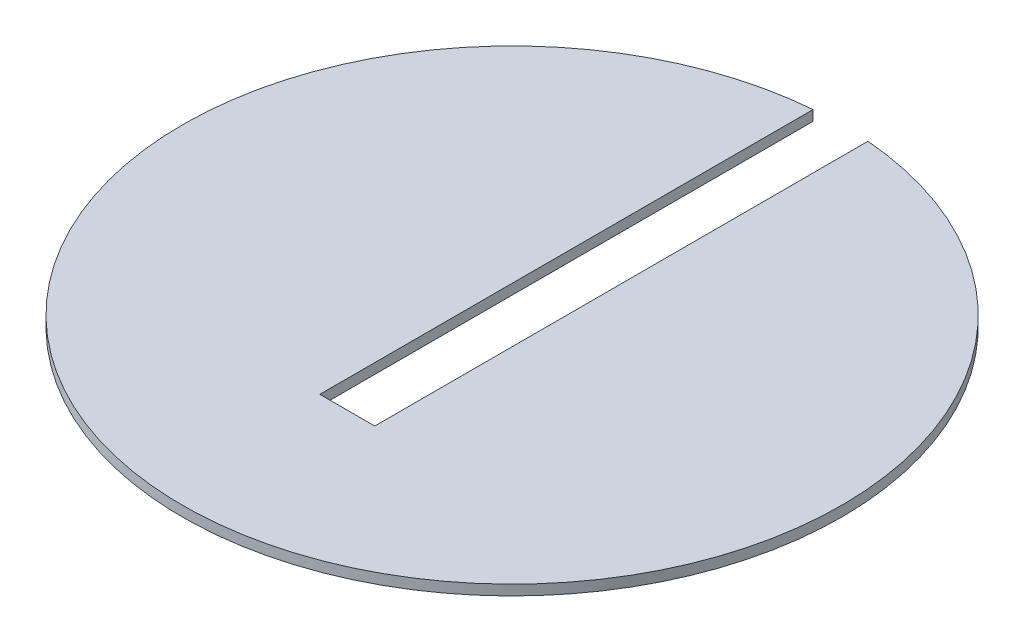
ISO-10303-21;
HEADER;
FILE_DESCRIPTION(('STEP AP214'),'2;1');
FILE_NAME('part.step','',(''),(''),'','','');
FILE_SCHEMA(('AUTOMOTIVE_DESIGN { 1 0 10303 214 1 1 1 1 }'));
ENDSEC;
DATA;
#1=APPLICATION_CONTEXT('core data for automotive mechanical design processes');
#2=APPLICATION_PROTOCOL_DEFINITION('international standard','automotive_design',2000,#1);
#3=PRODUCT_CONTEXT('',#1,'mechanical');
#4=PRODUCT('Part','Part','',(#3));
#5=PRODUCT_RELATED_PRODUCT_CATEGORY('part','',(#4));
#6=PRODUCT_DEFINITION_FORMATION('','',#4);
#7=PRODUCT_DEFINITION_CONTEXT('part definition',#1,'design');
#8=PRODUCT_DEFINITION('design','',#6,#7);
#9=PRODUCT_DEFINITION_SHAPE('','',#8);
#10=(LENGTH_UNIT() NAMED_UNIT(*) SI_UNIT(.MILLI.,.METRE.));
#11=(NAMED_UNIT(*) PLANE_ANGLE_UNIT() SI_UNIT($,.RADIAN.));
#12=(NAMED_UNIT(*) SI_UNIT($,.STERADIAN.) SOLID_ANGLE_UNIT());
#13=UNCERTAINTY_MEASURE_WITH_UNIT(LENGTH_MEASURE(1.E-05),#10,'distance_accuracy_value','');
#14=(GEOMETRIC_REPRESENTATION_CONTEXT(3) GLOBAL_UNCERTAINTY_ASSIGNED_CONTEXT((#13)) GLOBAL_UNIT_ASSIGNED_CONTEXT((#10,
#11,#12)) REPRESENTATION_CONTEXT('',''));
#15=CARTESIAN_POINT('',(0.,0.,0.));
#16=DIRECTION('',(0.,0.,1.));
#17=DIRECTION('',(1.,0.,0.));
#18=AXIS2_PLACEMENT_3D('',#15,#16,#17);
#19=CARTESIAN_POINT('',(0.,2.8,0.));
#20=DIRECTION('',(0.,-1.,0.));
#21=DIRECTION('',(0.,0.,-1.));
#22=AXIS2_PLACEMENT_3D('',#19,#20,#21);
#23=CYLINDRICAL_SURFACE('',#22,90.);
#24=CARTESIAN_POINT('',(0.,0.,0.));
#25=DIRECTION('',(0.,1.,0.));
#26=DIRECTION('',(0.,0.,1.));
#27=AXIS2_PLACEMENT_3D('',#24,#25,#26);
#28=CIRCLE('',#27,90.);
#29=CARTESIAN_POINT('',(-7.5,0.,-89.6869555732605));
#30=VERTEX_POINT('',#29);
#31=CARTESIAN_POINT('',(7.5,0.,-89.6869555732605));
#32=VERTEX_POINT('',#31);
#33=EDGE_CURVE('E96',#30,#32,#28,.T.);
#34=ORIENTED_EDGE('',*,*,#33,.T.);
#35=DIRECTION('',(0.,-1.,0.));
#36=VECTOR('',#35,1.);
#37=CARTESIAN_POINT('',(7.5,2.8,-89.6869555732605));
#38=LINE('',#37,#36);
#39=CARTESIAN_POINT('',(7.5,2.8,-89.6869555732605));
#40=VERTEX_POINT('',#39);
#41=EDGE_CURVE('E11',#40,#32,#38,.T.);
#42=ORIENTED_EDGE('',*,*,#41,.F.);
#43=CARTESIAN_POINT('',(0.,2.8,0.));
#44=DIRECTION('',(0.,1.,0.));
#45=DIRECTION('',(0.,0.,1.));
#46=AXIS2_PLACEMENT_3D('',#43,#44,#45);
#47=CIRCLE('',#46,90.);
#48=CARTESIAN_POINT('',(-7.5,2.8,-89.6869555732605));
#49=VERTEX_POINT('',#48);
#50=EDGE_CURVE('E84',#49,#40,#47,.T.);
#51=ORIENTED_EDGE('',*,*,#50,.F.);
#52=DIRECTION('',(0.,-1.,0.));
#53=VECTOR('',#52,1.);
#54=CARTESIAN_POINT('',(-7.5,2.8,-89.6869555732605));
#55=LINE('',#54,#53);
#56=EDGE_CURVE('E92',#49,#30,#55,.T.);
#57=ORIENTED_EDGE('',*,*,#56,.T.);
#58=EDGE_LOOP('',(#34,#42,#51,#57));
#59=FACE_BOUND('',#58,.T.);
#60=ADVANCED_FACE('F33',(#59),#23,.T.);
#61=CARTESIAN_POINT('',(7.5,2.8,45.));
#62=DIRECTION('',(1.,0.,0.));
#63=DIRECTION('',(0.,0.,-1.));
#64=AXIS2_PLACEMENT_3D('',#61,#62,#63);
#65=PLANE('',#64);
#66=DIRECTION('',(0.,0.,1.));
#67=VECTOR('',#66,1.);
#68=CARTESIAN_POINT('',(7.5,0.,45.));
#69=LINE('',#68,#67);
#70=CARTESIAN_POINT('',(7.5,0.,45.));
#71=VERTEX_POINT('',#70);
#72=EDGE_CURVE('E88',#32,#71,#69,.T.);
#73=ORIENTED_EDGE('',*,*,#72,.T.);
#74=DIRECTION('',(0.,-1.,0.));
#75=VECTOR('',#74,1.);
#76=CARTESIAN_POINT('',(7.5,2.8,45.));
#77=LINE('',#76,#75);
#78=CARTESIAN_POINT('',(7.5,2.8,45.));
#79=VERTEX_POINT('',#78);
#80=EDGE_CURVE('E41',#79,#71,#77,.T.);
#81=ORIENTED_EDGE('',*,*,#80,.F.);
#82=DIRECTION('',(0.,0.,1.));
#83=VECTOR('',#82,1.);
#84=CARTESIAN_POINT('',(7.5,2.8,45.));
#85=LINE('',#84,#83);
#86=EDGE_CURVE('E79',#40,#79,#85,.T.);
#87=ORIENTED_EDGE('',*,*,#86,.F.);
#88=ORIENTED_EDGE('',*,*,#41,.T.);
#89=EDGE_LOOP('',(#73,#81,#87,#88));
#90=FACE_BOUND('',#89,.T.);
#91=ADVANCED_FACE('F87',(#90),#65,.F.);
#92=CARTESIAN_POINT('',(-7.5,2.8,45.));
#93=DIRECTION('',(0.,0.,1.));
#94=DIRECTION('',(1.,0.,0.));
#95=AXIS2_PLACEMENT_3D('',#92,#93,#94);
#96=PLANE('',#95);
#97=DIRECTION('',(-1.,0.,0.));
#98=VECTOR('',#97,1.);
#99=CARTESIAN_POINT('',(-7.5,0.,45.));
#100=LINE('',#99,#98);
#101=CARTESIAN_POINT('',(-7.5,0.,45.));
#102=VERTEX_POINT('',#101);
#103=EDGE_CURVE('E66',#71,#102,#100,.T.);
#104=ORIENTED_EDGE('',*,*,#103,.T.);
#105=DIRECTION('',(0.,-1.,0.));
#106=VECTOR('',#105,1.);
#107=CARTESIAN_POINT('',(-7.5,2.8,45.));
#108=LINE('',#107,#106);
#109=CARTESIAN_POINT('',(-7.5,2.8,45.));
#110=VERTEX_POINT('',#109);
#111=EDGE_CURVE('E89',#110,#102,#108,.T.);
#112=ORIENTED_EDGE('',*,*,#111,.F.);
#113=DIRECTION('',(-1.,0.,0.));
#114=VECTOR('',#113,1.);
#115=CARTESIAN_POINT('',(-7.5,2.8,45.));
#116=LINE('',#115,#114);
#117=EDGE_CURVE('E82',#79,#110,#116,.T.);
#118=ORIENTED_EDGE('',*,*,#117,.F.);
#119=ORIENTED_EDGE('',*,*,#80,.T.);
#120=EDGE_LOOP('',(#104,#112,#118,#119));
#121=FACE_BOUND('',#120,.T.);
#122=ADVANCED_FACE('F90',(#121),#96,.F.);
#123=CARTESIAN_POINT('',(-7.5,2.8,45.));
#124=DIRECTION('',(-1.,0.,0.));
#125=DIRECTION('',(0.,0.,1.));
#126=AXIS2_PLACEMENT_3D('',#123,#124,#125);
#127=PLANE('',#126);
#128=DIRECTION('',(0.,0.,-1.));
#129=VECTOR('',#128,1.);
#130=CARTESIAN_POINT('',(-7.5,0.,45.));
#131=LINE('',#130,#129);
#132=EDGE_CURVE('E72',#102,#30,#131,.T.);
#133=ORIENTED_EDGE('',*,*,#132,.T.);
#134=ORIENTED_EDGE('',*,*,#56,.F.);
#135=DIRECTION('',(0.,0.,-1.));
#136=VECTOR('',#135,1.);
#137=CARTESIAN_POINT('',(-7.5,2.8,45.));
#138=LINE('',#137,#136);
#139=EDGE_CURVE('E49',#110,#49,#138,.T.);
#140=ORIENTED_EDGE('',*,*,#139,.F.);
#141=ORIENTED_EDGE('',*,*,#111,.T.);
#142=EDGE_LOOP('',(#133,#134,#140,#141));
#143=FACE_BOUND('',#142,.T.);
#144=ADVANCED_FACE('F103',(#143),#127,.F.);
#145=CARTESIAN_POINT('',(0.,2.8,0.));
#146=DIRECTION('',(0.,1.,0.));
#147=DIRECTION('',(0.,0.,1.));
#148=AXIS2_PLACEMENT_3D('',#145,#146,#147);
#149=PLANE('',#148);
#150=ORIENTED_EDGE('',*,*,#50,.T.);
#151=ORIENTED_EDGE('',*,*,#86,.T.);
#152=ORIENTED_EDGE('',*,*,#117,.T.);
#153=ORIENTED_EDGE('',*,*,#139,.T.);
#154=EDGE_LOOP('',(#150,#151,#152,#153));
#155=FACE_BOUND('',#154,.T.);
#156=ADVANCED_FACE('F80',(#155),#149,.T.);
#157=CARTESIAN_POINT('',(0.,0.,0.));
#158=DIRECTION('',(0.,1.,0.));
#159=DIRECTION('',(0.,0.,1.));
#160=AXIS2_PLACEMENT_3D('',#157,#158,#159);
#161=PLANE('',#160);
#162=ORIENTED_EDGE('',*,*,#33,.F.);
#163=ORIENTED_EDGE('',*,*,#132,.F.);
#164=ORIENTED_EDGE('',*,*,#103,.F.);
#165=ORIENTED_EDGE('',*,*,#72,.F.);
#166=EDGE_LOOP('',(#162,#163,#164,#165));
#167=FACE_BOUND('',#166,.T.);
#168=ADVANCED_FACE('F106',(#167),#161,.F.);
#169=CLOSED_SHELL('',(#60,#91,#122,#144,#156,#168));
#170=MANIFOLD_SOLID_BREP('B2',#169);
#171=ADVANCED_BREP_SHAPE_REPRESENTATION('',(#18,#170),#14);
#172=SHAPE_DEFINITION_REPRESENTATION(#9,#171);
ENDSEC;
END-ISO-10303-21;
